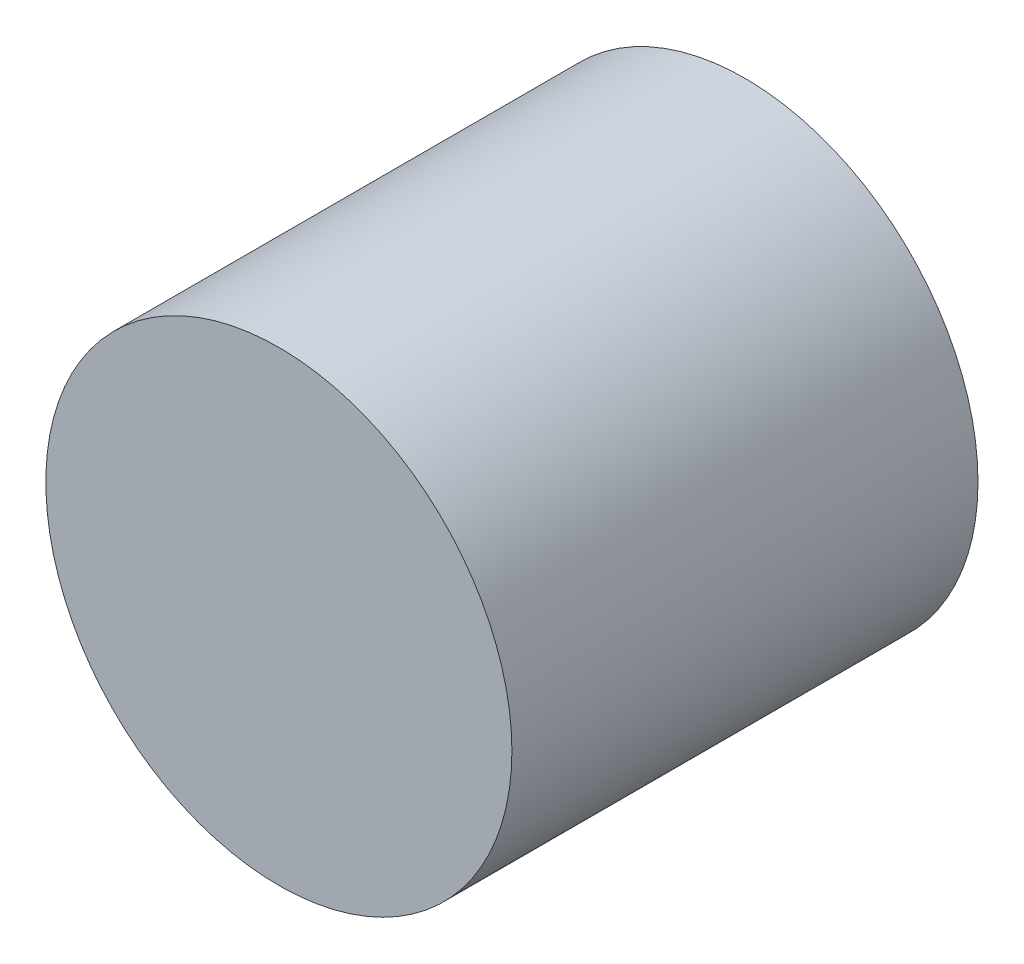
ISO-10303-21;
HEADER;
FILE_DESCRIPTION(('STEP AP214'),'2;1');
FILE_NAME('part.step','',(''),(''),'','','');
FILE_SCHEMA(('AUTOMOTIVE_DESIGN { 1 0 10303 214 1 1 1 1 }'));
ENDSEC;
DATA;
#1=APPLICATION_CONTEXT('core data for automotive mechanical design processes');
#2=APPLICATION_PROTOCOL_DEFINITION('international standard','automotive_design',2000,#1);
#3=PRODUCT_CONTEXT('',#1,'mechanical');
#4=PRODUCT('Part','Part','',(#3));
#5=PRODUCT_RELATED_PRODUCT_CATEGORY('part','',(#4));
#6=PRODUCT_DEFINITION_FORMATION('','',#4);
#7=PRODUCT_DEFINITION_CONTEXT('part definition',#1,'design');
#8=PRODUCT_DEFINITION('design','',#6,#7);
#9=PRODUCT_DEFINITION_SHAPE('','',#8);
#10=(LENGTH_UNIT() NAMED_UNIT(*) SI_UNIT(.MILLI.,.METRE.));
#11=(NAMED_UNIT(*) PLANE_ANGLE_UNIT() SI_UNIT($,.RADIAN.));
#12=(NAMED_UNIT(*) SI_UNIT($,.STERADIAN.) SOLID_ANGLE_UNIT());
#13=UNCERTAINTY_MEASURE_WITH_UNIT(LENGTH_MEASURE(1.E-05),#10,'distance_accuracy_value','');
#14=(GEOMETRIC_REPRESENTATION_CONTEXT(3) GLOBAL_UNCERTAINTY_ASSIGNED_CONTEXT((#13)) GLOBAL_UNIT_ASSIGNED_CONTEXT((#10,
#11,#12)) REPRESENTATION_CONTEXT('',''));
#15=CARTESIAN_POINT('',(0.,0.,0.));
#16=DIRECTION('',(0.,0.,1.));
#17=DIRECTION('',(1.,0.,0.));
#18=AXIS2_PLACEMENT_3D('',#15,#16,#17);
#19=CARTESIAN_POINT('',(0.,0.,-24.));
#20=DIRECTION('',(0.,0.,1.));
#21=DIRECTION('',(1.,0.,0.));
#22=AXIS2_PLACEMENT_3D('',#19,#20,#21);
#23=CYLINDRICAL_SURFACE('',#22,12.);
#24=CARTESIAN_POINT('',(0.,0.,-24.));
#25=DIRECTION('',(0.,0.,1.));
#26=DIRECTION('',(1.,0.,0.));
#27=AXIS2_PLACEMENT_3D('',#24,#25,#26);
#28=CIRCLE('',#27,12.);
#29=CARTESIAN_POINT('',(12.,0.,-24.));
#30=VERTEX_POINT('',#29);
#31=EDGE_CURVE('E10',#30,#30,#28,.T.);
#32=ORIENTED_EDGE('',*,*,#31,.T.);
#33=EDGE_LOOP('',(#32));
#34=FACE_BOUND('',#33,.T.);
#35=CARTESIAN_POINT('',(0.,0.,0.));
#36=DIRECTION('',(0.,0.,1.));
#37=DIRECTION('',(1.,0.,0.));
#38=AXIS2_PLACEMENT_3D('',#35,#36,#37);
#39=CIRCLE('',#38,12.);
#40=CARTESIAN_POINT('',(12.,0.,0.));
#41=VERTEX_POINT('',#40);
#42=EDGE_CURVE('E40',#41,#41,#39,.T.);
#43=ORIENTED_EDGE('',*,*,#42,.F.);
#44=EDGE_LOOP('',(#43));
#45=FACE_BOUND('',#44,.T.);
#46=ADVANCED_FACE('F37',(#34,#45),#23,.T.);
#47=CARTESIAN_POINT('',(0.,0.,-24.));
#48=DIRECTION('',(0.,0.,1.));
#49=DIRECTION('',(1.,0.,0.));
#50=AXIS2_PLACEMENT_3D('',#47,#48,#49);
#51=PLANE('',#50);
#52=ORIENTED_EDGE('',*,*,#31,.F.);
#53=EDGE_LOOP('',(#52));
#54=FACE_BOUND('',#53,.T.);
#55=ADVANCED_FACE('F52',(#54),#51,.F.);
#56=CARTESIAN_POINT('',(0.,0.,0.));
#57=DIRECTION('',(0.,0.,1.));
#58=DIRECTION('',(1.,0.,0.));
#59=AXIS2_PLACEMENT_3D('',#56,#57,#58);
#60=PLANE('',#59);
#61=ORIENTED_EDGE('',*,*,#42,.T.);
#62=EDGE_LOOP('',(#61));
#63=FACE_BOUND('',#62,.T.);
#64=ADVANCED_FACE('F49',(#63),#60,.T.);
#65=CLOSED_SHELL('',(#46,#55,#64));
#66=MANIFOLD_SOLID_BREP('B2',#65);
#67=ADVANCED_BREP_SHAPE_REPRESENTATION('',(#18,#66),#14);
#68=SHAPE_DEFINITION_REPRESENTATION(#9,#67);
ENDSEC;
END-ISO-10303-21;
